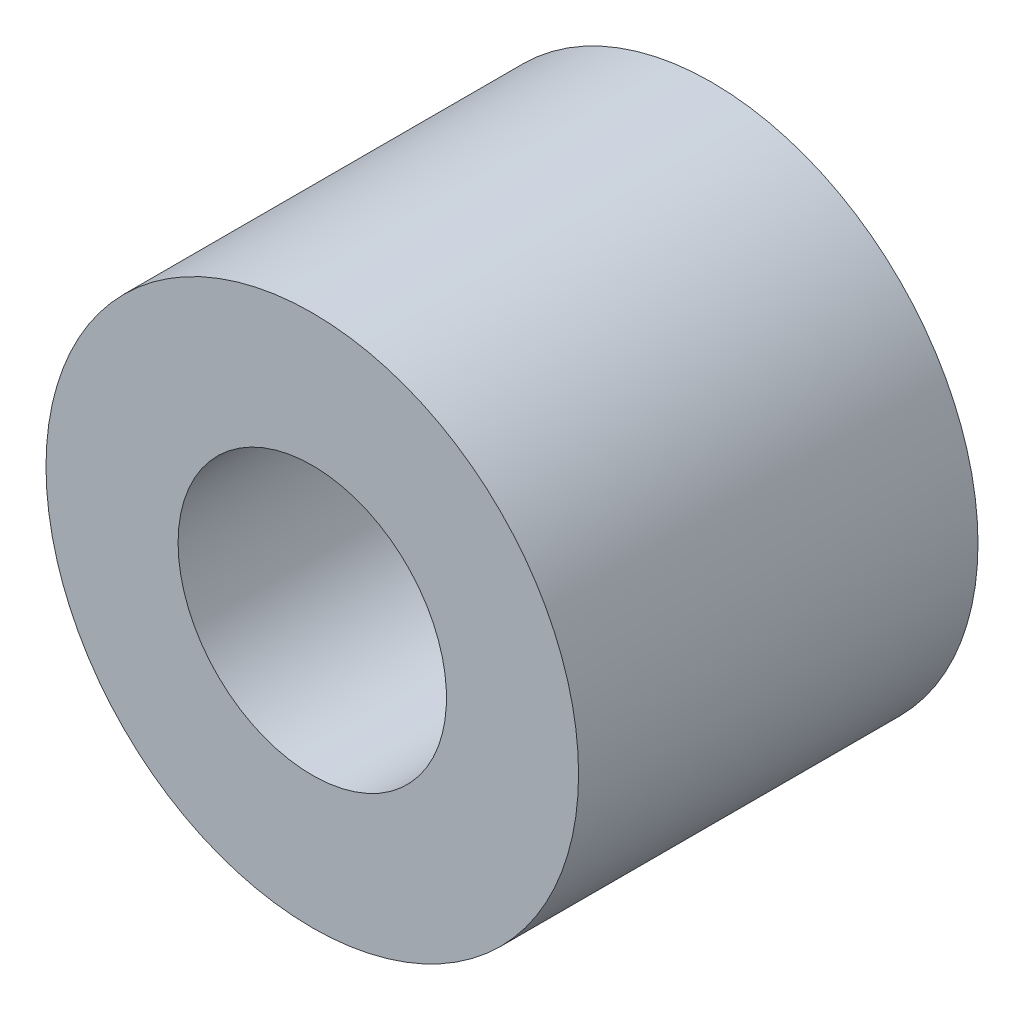
ISO-10303-21;
HEADER;
FILE_DESCRIPTION(('STEP AP214'),'2;1');
FILE_NAME('part.step','',(''),(''),'','','');
FILE_SCHEMA(('AUTOMOTIVE_DESIGN { 1 0 10303 214 1 1 1 1 }'));
ENDSEC;
DATA;
#1=APPLICATION_CONTEXT('core data for automotive mechanical design processes');
#2=APPLICATION_PROTOCOL_DEFINITION('international standard','automotive_design',2000,#1);
#3=PRODUCT_CONTEXT('',#1,'mechanical');
#4=PRODUCT('Part','Part','',(#3));
#5=PRODUCT_RELATED_PRODUCT_CATEGORY('part','',(#4));
#6=PRODUCT_DEFINITION_FORMATION('','',#4);
#7=PRODUCT_DEFINITION_CONTEXT('part definition',#1,'design');
#8=PRODUCT_DEFINITION('design','',#6,#7);
#9=PRODUCT_DEFINITION_SHAPE('','',#8);
#10=(LENGTH_UNIT() NAMED_UNIT(*) SI_UNIT(.MILLI.,.METRE.));
#11=(NAMED_UNIT(*) PLANE_ANGLE_UNIT() SI_UNIT($,.RADIAN.));
#12=(NAMED_UNIT(*) SI_UNIT($,.STERADIAN.) SOLID_ANGLE_UNIT());
#13=UNCERTAINTY_MEASURE_WITH_UNIT(LENGTH_MEASURE(1.E-05),#10,'distance_accuracy_value','');
#14=(GEOMETRIC_REPRESENTATION_CONTEXT(3) GLOBAL_UNCERTAINTY_ASSIGNED_CONTEXT((#13)) GLOBAL_UNIT_ASSIGNED_CONTEXT((#10,
#11,#12)) REPRESENTATION_CONTEXT('',''));
#15=CARTESIAN_POINT('',(0.,0.,0.));
#16=DIRECTION('',(0.,0.,1.));
#17=DIRECTION('',(1.,0.,0.));
#18=AXIS2_PLACEMENT_3D('',#15,#16,#17);
#19=CARTESIAN_POINT('',(0.,0.,4.7625));
#20=DIRECTION('',(0.,0.,1.));
#21=DIRECTION('',(1.,0.,0.));
#22=AXIS2_PLACEMENT_3D('',#19,#20,#21);
#23=PLANE('',#22);
#24=CARTESIAN_POINT('',(0.,0.,4.7625));
#25=DIRECTION('',(0.,0.,1.));
#26=DIRECTION('',(1.,0.,0.));
#27=AXIS2_PLACEMENT_3D('',#24,#25,#26);
#28=CIRCLE('',#27,6.35);
#29=CARTESIAN_POINT('',(-6.35,0.,4.7625));
#30=VERTEX_POINT('',#29);
#31=EDGE_CURVE('E10',#30,#30,#28,.T.);
#32=ORIENTED_EDGE('',*,*,#31,.T.);
#33=EDGE_LOOP('',(#32));
#34=FACE_BOUND('',#33,.T.);
#35=CARTESIAN_POINT('',(0.,0.,4.7625));
#36=DIRECTION('',(0.,0.,1.));
#37=DIRECTION('',(1.,0.,0.));
#38=AXIS2_PLACEMENT_3D('',#35,#36,#37);
#39=CIRCLE('',#38,3.2004);
#40=CARTESIAN_POINT('',(-3.2004,0.,4.7625));
#41=VERTEX_POINT('',#40);
#42=EDGE_CURVE('E41',#41,#41,#39,.T.);
#43=ORIENTED_EDGE('',*,*,#42,.F.);
#44=EDGE_LOOP('',(#43));
#45=FACE_BOUND('',#44,.T.);
#46=ADVANCED_FACE('F30',(#34,#45),#23,.T.);
#47=CARTESIAN_POINT('',(0.,0.,-4.7625));
#48=DIRECTION('',(0.,0.,1.));
#49=DIRECTION('',(1.,0.,0.));
#50=AXIS2_PLACEMENT_3D('',#47,#48,#49);
#51=PLANE('',#50);
#52=CARTESIAN_POINT('',(0.,0.,-4.7625));
#53=DIRECTION('',(0.,0.,1.));
#54=DIRECTION('',(1.,0.,0.));
#55=AXIS2_PLACEMENT_3D('',#52,#53,#54);
#56=CIRCLE('',#55,6.35);
#57=CARTESIAN_POINT('',(-6.35,0.,-4.7625));
#58=VERTEX_POINT('',#57);
#59=EDGE_CURVE('E34',#58,#58,#56,.T.);
#60=ORIENTED_EDGE('',*,*,#59,.F.);
#61=EDGE_LOOP('',(#60));
#62=FACE_BOUND('',#61,.T.);
#63=CARTESIAN_POINT('',(0.,0.,-4.7625));
#64=DIRECTION('',(0.,0.,1.));
#65=DIRECTION('',(1.,0.,0.));
#66=AXIS2_PLACEMENT_3D('',#63,#64,#65);
#67=CIRCLE('',#66,3.2004);
#68=CARTESIAN_POINT('',(-3.2004,0.,-4.7625));
#69=VERTEX_POINT('',#68);
#70=EDGE_CURVE('E43',#69,#69,#67,.T.);
#71=ORIENTED_EDGE('',*,*,#70,.T.);
#72=EDGE_LOOP('',(#71));
#73=FACE_BOUND('',#72,.T.);
#74=ADVANCED_FACE('F53',(#62,#73),#51,.F.);
#75=CARTESIAN_POINT('',(0.,0.,4.7625));
#76=DIRECTION('',(0.,0.,-1.));
#77=DIRECTION('',(-1.,0.,0.));
#78=AXIS2_PLACEMENT_3D('',#75,#76,#77);
#79=CYLINDRICAL_SURFACE('',#78,6.35);
#80=CARTESIAN_POINT('',(-6.35,0.,4.7625));
#81=CARTESIAN_POINT('',(-6.35,0.,4.66328125));
#82=CARTESIAN_POINT('',(-6.35,0.,4.5640625));
#83=CARTESIAN_POINT('',(-6.35,0.,4.365625));
#84=CARTESIAN_POINT('',(-6.35,0.,4.26640625));
#85=CARTESIAN_POINT('',(-6.35,0.,4.06796875));
#86=CARTESIAN_POINT('',(-6.35,0.,3.96875));
#87=CARTESIAN_POINT('',(-6.35,0.,3.7703125));
#88=CARTESIAN_POINT('',(-6.35,0.,3.67109375));
#89=CARTESIAN_POINT('',(-6.35,0.,3.47265625));
#90=CARTESIAN_POINT('',(-6.35,0.,3.3734375));
#91=CARTESIAN_POINT('',(-6.35,0.,3.175));
#92=CARTESIAN_POINT('',(-6.35,0.,3.07578125));
#93=CARTESIAN_POINT('',(-6.35,0.,2.87734375));
#94=CARTESIAN_POINT('',(-6.35,0.,2.778125));
#95=CARTESIAN_POINT('',(-6.35,0.,2.5796875));
#96=CARTESIAN_POINT('',(-6.35,0.,2.48046875));
#97=CARTESIAN_POINT('',(-6.35,0.,2.28203125));
#98=CARTESIAN_POINT('',(-6.35,0.,2.1828125));
#99=CARTESIAN_POINT('',(-6.35,0.,1.984375));
#100=CARTESIAN_POINT('',(-6.35,0.,1.88515625));
#101=CARTESIAN_POINT('',(-6.35,0.,1.68671875));
#102=CARTESIAN_POINT('',(-6.35,0.,1.5875));
#103=CARTESIAN_POINT('',(-6.35,0.,1.3890625));
#104=CARTESIAN_POINT('',(-6.35,0.,1.28984375));
#105=CARTESIAN_POINT('',(-6.35,0.,1.09140625));
#106=CARTESIAN_POINT('',(-6.35,0.,0.992187499999999));
#107=CARTESIAN_POINT('',(-6.35,0.,0.793749999999999));
#108=CARTESIAN_POINT('',(-6.35,0.,0.694531249999999));
#109=CARTESIAN_POINT('',(-6.35,0.,0.496093749999999));
#110=CARTESIAN_POINT('',(-6.35,0.,0.396874999999999));
#111=CARTESIAN_POINT('',(-6.35,0.,0.198437499999999));
#112=CARTESIAN_POINT('',(-6.35,0.,0.0992187499999992));
#113=CARTESIAN_POINT('',(-6.35,0.,-0.0992187500000009));
#114=CARTESIAN_POINT('',(-6.35,0.,-0.198437500000001));
#115=CARTESIAN_POINT('',(-6.35,0.,-0.396875000000001));
#116=CARTESIAN_POINT('',(-6.35,0.,-0.496093750000001));
#117=CARTESIAN_POINT('',(-6.35,0.,-0.694531250000001));
#118=CARTESIAN_POINT('',(-6.35,0.,-0.793750000000001));
#119=CARTESIAN_POINT('',(-6.35,0.,-0.992187500000002));
#120=CARTESIAN_POINT('',(-6.35,0.,-1.09140625));
#121=CARTESIAN_POINT('',(-6.35,0.,-1.28984375));
#122=CARTESIAN_POINT('',(-6.35,0.,-1.3890625));
#123=CARTESIAN_POINT('',(-6.35,0.,-1.5875));
#124=CARTESIAN_POINT('',(-6.35,0.,-1.68671875));
#125=CARTESIAN_POINT('',(-6.35,0.,-1.88515625));
#126=CARTESIAN_POINT('',(-6.35,0.,-1.984375));
#127=CARTESIAN_POINT('',(-6.35,0.,-2.1828125));
#128=CARTESIAN_POINT('',(-6.35,0.,-2.28203125));
#129=CARTESIAN_POINT('',(-6.35,0.,-2.48046875));
#130=CARTESIAN_POINT('',(-6.35,0.,-2.5796875));
#131=CARTESIAN_POINT('',(-6.35,0.,-2.778125));
#132=CARTESIAN_POINT('',(-6.35,0.,-2.87734375));
#133=CARTESIAN_POINT('',(-6.35,0.,-3.07578125));
#134=CARTESIAN_POINT('',(-6.35,0.,-3.175));
#135=CARTESIAN_POINT('',(-6.35,0.,-3.3734375));
#136=CARTESIAN_POINT('',(-6.35,0.,-3.47265625));
#137=CARTESIAN_POINT('',(-6.35,0.,-3.67109375));
#138=CARTESIAN_POINT('',(-6.35,0.,-3.7703125));
#139=CARTESIAN_POINT('',(-6.35,0.,-3.96875));
#140=CARTESIAN_POINT('',(-6.35,0.,-4.06796875));
#141=CARTESIAN_POINT('',(-6.35,0.,-4.26640625));
#142=CARTESIAN_POINT('',(-6.35,0.,-4.365625));
#143=CARTESIAN_POINT('',(-6.35,0.,-4.5640625));
#144=CARTESIAN_POINT('',(-6.35,0.,-4.66328125));
#145=CARTESIAN_POINT('',(-6.35,0.,-4.7625));
#146=B_SPLINE_CURVE_WITH_KNOTS('',3,(#80,#81,#82,#83,#84,#85,#86,#87,#88,#89,#90,#91,#92,#93,
#94,#95,#96,#97,#98,#99,#100,#101,#102,#103,#104,#105,#106,#107,#108,#109,#110,#111,#112,#113,
#114,#115,#116,#117,#118,#119,#120,#121,#122,#123,#124,#125,#126,#127,#128,#129,#130,#131,#132,
#133,#134,#135,#136,#137,#138,#139,#140,#141,#142,#143,#144,#145),.UNSPECIFIED.,.F.,.F.,(4,2,2,
2,2,2,2,2,2,2,2,2,2,2,2,2,2,2,2,2,2,2,2,2,2,2,2,2,2,2,2,2,4),(0.,0.297656249999999,
0.595312499999999,0.89296875,1.190625,1.48828125,1.7859375,2.08359375,2.38125,2.67890625,
2.9765625,3.27421875,3.571875,3.86953125,4.1671875,4.46484375,4.7625,5.06015625,5.3578125,
5.65546875,5.953125,6.25078125,6.5484375,6.84609375,7.14375,7.44140625,7.7390625,8.03671875,
8.334375,8.63203125,8.9296875,9.22734375,9.525),.UNSPECIFIED.);
#147=EDGE_CURVE('BSEAM32',#30,#58,#146,.T.);
#148=ORIENTED_EDGE('',*,*,#31,.F.);
#149=ORIENTED_EDGE('',*,*,#59,.T.);
#150=ORIENTED_EDGE('',*,*,#147,.T.);
#151=ORIENTED_EDGE('',*,*,#147,.F.);
#152=EDGE_LOOP('',(#148,#150,#149,#151));
#153=FACE_BOUND('',#152,.T.);
#154=ADVANCED_FACE('F32',(#153),#79,.T.);
#155=CARTESIAN_POINT('',(0.,0.,4.7625));
#156=DIRECTION('',(0.,0.,-1.));
#157=DIRECTION('',(-1.,0.,0.));
#158=AXIS2_PLACEMENT_3D('',#155,#156,#157);
#159=CYLINDRICAL_SURFACE('',#158,3.2004);
#160=CARTESIAN_POINT('',(-3.2004,0.,4.7625));
#161=CARTESIAN_POINT('',(-3.2004,0.,4.66328125));
#162=CARTESIAN_POINT('',(-3.2004,0.,4.5640625));
#163=CARTESIAN_POINT('',(-3.2004,0.,4.365625));
#164=CARTESIAN_POINT('',(-3.2004,0.,4.26640625));
#165=CARTESIAN_POINT('',(-3.2004,0.,4.06796875));
#166=CARTESIAN_POINT('',(-3.2004,0.,3.96875));
#167=CARTESIAN_POINT('',(-3.2004,0.,3.7703125));
#168=CARTESIAN_POINT('',(-3.2004,0.,3.67109375));
#169=CARTESIAN_POINT('',(-3.2004,0.,3.47265625));
#170=CARTESIAN_POINT('',(-3.2004,0.,3.3734375));
#171=CARTESIAN_POINT('',(-3.2004,0.,3.175));
#172=CARTESIAN_POINT('',(-3.2004,0.,3.07578125));
#173=CARTESIAN_POINT('',(-3.2004,0.,2.87734375));
#174=CARTESIAN_POINT('',(-3.2004,0.,2.778125));
#175=CARTESIAN_POINT('',(-3.2004,0.,2.5796875));
#176=CARTESIAN_POINT('',(-3.2004,0.,2.48046875));
#177=CARTESIAN_POINT('',(-3.2004,0.,2.28203125));
#178=CARTESIAN_POINT('',(-3.2004,0.,2.1828125));
#179=CARTESIAN_POINT('',(-3.2004,0.,1.984375));
#180=CARTESIAN_POINT('',(-3.2004,0.,1.88515625));
#181=CARTESIAN_POINT('',(-3.2004,0.,1.68671875));
#182=CARTESIAN_POINT('',(-3.2004,0.,1.5875));
#183=CARTESIAN_POINT('',(-3.2004,0.,1.3890625));
#184=CARTESIAN_POINT('',(-3.2004,0.,1.28984375));
#185=CARTESIAN_POINT('',(-3.2004,0.,1.09140625));
#186=CARTESIAN_POINT('',(-3.2004,0.,0.992187499999999));
#187=CARTESIAN_POINT('',(-3.2004,0.,0.79375));
#188=CARTESIAN_POINT('',(-3.2004,0.,0.69453125));
#189=CARTESIAN_POINT('',(-3.2004,0.,0.49609375));
#190=CARTESIAN_POINT('',(-3.2004,0.,0.396875));
#191=CARTESIAN_POINT('',(-3.2004,0.,0.1984375));
#192=CARTESIAN_POINT('',(-3.2004,0.,0.0992187500000001));
#193=CARTESIAN_POINT('',(-3.2004,0.,-0.0992187500000001));
#194=CARTESIAN_POINT('',(-3.2004,0.,-0.1984375));
#195=CARTESIAN_POINT('',(-3.2004,0.,-0.396875));
#196=CARTESIAN_POINT('',(-3.2004,0.,-0.49609375));
#197=CARTESIAN_POINT('',(-3.2004,0.,-0.69453125));
#198=CARTESIAN_POINT('',(-3.2004,0.,-0.793750000000001));
#199=CARTESIAN_POINT('',(-3.2004,0.,-0.992187500000001));
#200=CARTESIAN_POINT('',(-3.2004,0.,-1.09140625));
#201=CARTESIAN_POINT('',(-3.2004,0.,-1.28984375));
#202=CARTESIAN_POINT('',(-3.2004,0.,-1.3890625));
#203=CARTESIAN_POINT('',(-3.2004,0.,-1.5875));
#204=CARTESIAN_POINT('',(-3.2004,0.,-1.68671875));
#205=CARTESIAN_POINT('',(-3.2004,0.,-1.88515625));
#206=CARTESIAN_POINT('',(-3.2004,0.,-1.984375));
#207=CARTESIAN_POINT('',(-3.2004,0.,-2.1828125));
#208=CARTESIAN_POINT('',(-3.2004,0.,-2.28203125));
#209=CARTESIAN_POINT('',(-3.2004,0.,-2.48046875));
#210=CARTESIAN_POINT('',(-3.2004,0.,-2.5796875));
#211=CARTESIAN_POINT('',(-3.2004,0.,-2.778125));
#212=CARTESIAN_POINT('',(-3.2004,0.,-2.87734375));
#213=CARTESIAN_POINT('',(-3.2004,0.,-3.07578125));
#214=CARTESIAN_POINT('',(-3.2004,0.,-3.175));
#215=CARTESIAN_POINT('',(-3.2004,0.,-3.3734375));
#216=CARTESIAN_POINT('',(-3.2004,0.,-3.47265625));
#217=CARTESIAN_POINT('',(-3.2004,0.,-3.67109375));
#218=CARTESIAN_POINT('',(-3.2004,0.,-3.7703125));
#219=CARTESIAN_POINT('',(-3.2004,0.,-3.96875));
#220=CARTESIAN_POINT('',(-3.2004,0.,-4.06796875));
#221=CARTESIAN_POINT('',(-3.2004,0.,-4.26640625));
#222=CARTESIAN_POINT('',(-3.2004,0.,-4.365625));
#223=CARTESIAN_POINT('',(-3.2004,0.,-4.5640625));
#224=CARTESIAN_POINT('',(-3.2004,0.,-4.66328125));
#225=CARTESIAN_POINT('',(-3.2004,0.,-4.7625));
#226=B_SPLINE_CURVE_WITH_KNOTS('',3,(#160,#161,#162,#163,#164,#165,#166,#167,#168,#169,#170,
#171,#172,#173,#174,#175,#176,#177,#178,#179,#180,#181,#182,#183,#184,#185,#186,#187,#188,#189,
#190,#191,#192,#193,#194,#195,#196,#197,#198,#199,#200,#201,#202,#203,#204,#205,#206,#207,#208,
#209,#210,#211,#212,#213,#214,#215,#216,#217,#218,#219,#220,#221,#222,#223,#224,#225),
.UNSPECIFIED.,.F.,.F.,(4,2,2,2,2,2,2,2,2,2,2,2,2,2,2,2,2,2,2,2,2,2,2,2,2,2,2,2,2,2,2,2,4),(0.,
0.29765625,0.5953125,0.892968750000001,1.190625,1.48828125,1.7859375,2.08359375,2.38125,
2.67890625,2.9765625,3.27421875,3.571875,3.86953125,4.1671875,4.46484375,4.7625,5.06015625,
5.3578125,5.65546875,5.953125,6.25078125,6.5484375,6.84609375,7.14375,7.44140625,7.7390625,
8.03671875,8.334375,8.63203125,8.9296875,9.22734375,9.525),.UNSPECIFIED.);
#227=EDGE_CURVE('BSEAM49',#41,#69,#226,.T.);
#228=ORIENTED_EDGE('',*,*,#42,.T.);
#229=ORIENTED_EDGE('',*,*,#70,.F.);
#230=ORIENTED_EDGE('',*,*,#227,.T.);
#231=ORIENTED_EDGE('',*,*,#227,.F.);
#232=EDGE_LOOP('',(#228,#230,#229,#231));
#233=FACE_BOUND('',#232,.T.);
#234=ADVANCED_FACE('F49',(#233),#159,.F.);
#235=CLOSED_SHELL('',(#46,#74,#154,#234));
#236=MANIFOLD_SOLID_BREP('B2',#235);
#237=ADVANCED_BREP_SHAPE_REPRESENTATION('',(#18,#236),#14);
#238=SHAPE_DEFINITION_REPRESENTATION(#9,#237);
ENDSEC;
END-ISO-10303-21;
